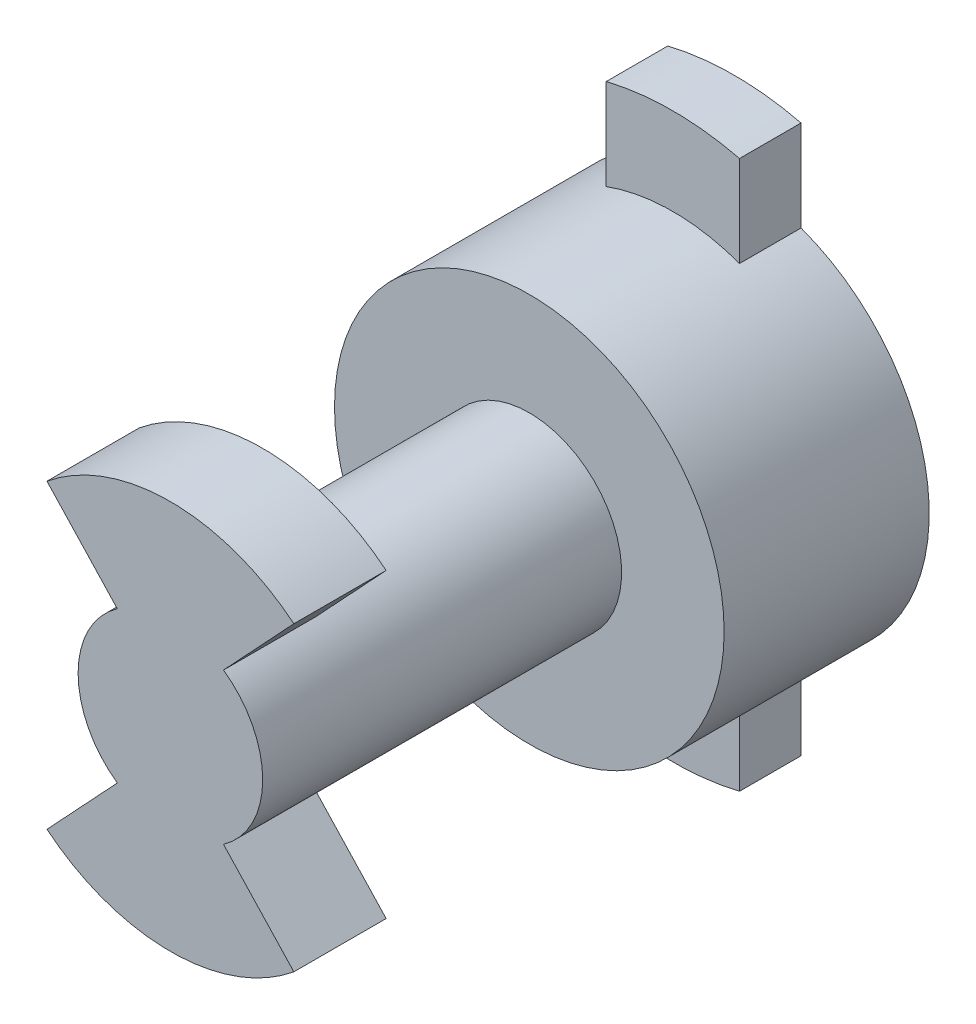
ISO-10303-21;
HEADER;
FILE_DESCRIPTION(('STEP AP214'),'2;1');
FILE_NAME('part.step','',(''),(''),'','','');
FILE_SCHEMA(('AUTOMOTIVE_DESIGN { 1 0 10303 214 1 1 1 1 }'));
ENDSEC;
DATA;
#1=APPLICATION_CONTEXT('core data for automotive mechanical design processes');
#2=APPLICATION_PROTOCOL_DEFINITION('international standard','automotive_design',2000,#1);
#3=PRODUCT_CONTEXT('',#1,'mechanical');
#4=PRODUCT('Part','Part','',(#3));
#5=PRODUCT_RELATED_PRODUCT_CATEGORY('part','',(#4));
#6=PRODUCT_DEFINITION_FORMATION('','',#4);
#7=PRODUCT_DEFINITION_CONTEXT('part definition',#1,'design');
#8=PRODUCT_DEFINITION('design','',#6,#7);
#9=PRODUCT_DEFINITION_SHAPE('','',#8);
#10=(LENGTH_UNIT() NAMED_UNIT(*) SI_UNIT(.MILLI.,.METRE.));
#11=(NAMED_UNIT(*) PLANE_ANGLE_UNIT() SI_UNIT($,.RADIAN.));
#12=(NAMED_UNIT(*) SI_UNIT($,.STERADIAN.) SOLID_ANGLE_UNIT());
#13=UNCERTAINTY_MEASURE_WITH_UNIT(LENGTH_MEASURE(1.E-05),#10,'distance_accuracy_value','');
#14=(GEOMETRIC_REPRESENTATION_CONTEXT(3) GLOBAL_UNCERTAINTY_ASSIGNED_CONTEXT((#13)) GLOBAL_UNIT_ASSIGNED_CONTEXT((#10,
#11,#12)) REPRESENTATION_CONTEXT('',''));
#15=CARTESIAN_POINT('',(0.,0.,0.));
#16=DIRECTION('',(0.,0.,1.));
#17=DIRECTION('',(1.,0.,0.));
#18=AXIS2_PLACEMENT_3D('',#15,#16,#17);
#19=CARTESIAN_POINT('',(0.,0.,-13.));
#20=DIRECTION('',(0.,0.,-1.));
#21=DIRECTION('',(-1.,0.,0.));
#22=AXIS2_PLACEMENT_3D('',#19,#20,#21);
#23=CYLINDRICAL_SURFACE('',#22,9.49890153901533);
#24=DIRECTION('',(0.,0.,-1.));
#25=VECTOR('',#24,1.);
#26=CARTESIAN_POINT('',(3.25,-8.92561653040886,-20.));
#27=LINE('',#26,#25);
#28=CARTESIAN_POINT('',(3.25,-8.92561653040886,-20.));
#29=VERTEX_POINT('',#28);
#30=CARTESIAN_POINT('',(3.25,-8.92561653040886,-23.));
#31=VERTEX_POINT('',#30);
#32=EDGE_CURVE('E185',#29,#31,#27,.T.);
#33=ORIENTED_EDGE('',*,*,#32,.T.);
#34=CARTESIAN_POINT('',(0.,0.,-23.));
#35=DIRECTION('',(0.,0.,-1.));
#36=DIRECTION('',(-1.,0.,0.));
#37=AXIS2_PLACEMENT_3D('',#34,#35,#36);
#38=CIRCLE('',#37,9.49890153901533);
#39=CARTESIAN_POINT('',(3.25,8.92561653040886,-23.));
#40=VERTEX_POINT('',#39);
#41=EDGE_CURVE('E249',#40,#31,#38,.T.);
#42=ORIENTED_EDGE('',*,*,#41,.F.);
#43=DIRECTION('',(0.,0.,-1.));
#44=VECTOR('',#43,1.);
#45=CARTESIAN_POINT('',(3.25,8.92561653040886,-20.));
#46=LINE('',#45,#44);
#47=CARTESIAN_POINT('',(3.25,8.92561653040886,-20.));
#48=VERTEX_POINT('',#47);
#49=EDGE_CURVE('E236',#48,#40,#46,.T.);
#50=ORIENTED_EDGE('',*,*,#49,.F.);
#51=CARTESIAN_POINT('',(0.,0.,-20.));
#52=DIRECTION('',(0.,0.,-1.));
#53=DIRECTION('',(-1.,0.,0.));
#54=AXIS2_PLACEMENT_3D('',#51,#52,#53);
#55=CIRCLE('',#54,9.49890153901533);
#56=CARTESIAN_POINT('',(-3.25,8.92561653040886,-20.));
#57=VERTEX_POINT('',#56);
#58=EDGE_CURVE('E219',#57,#48,#55,.T.);
#59=ORIENTED_EDGE('',*,*,#58,.F.);
#60=DIRECTION('',(0.,0.,-1.));
#61=VECTOR('',#60,1.);
#62=CARTESIAN_POINT('',(-3.25,8.92561653040886,-20.));
#63=LINE('',#62,#61);
#64=CARTESIAN_POINT('',(-3.25,8.92561653040886,-23.));
#65=VERTEX_POINT('',#64);
#66=EDGE_CURVE('E231',#57,#65,#63,.T.);
#67=ORIENTED_EDGE('',*,*,#66,.T.);
#68=CARTESIAN_POINT('',(-3.25,-8.92561653040886,-23.));
#69=VERTEX_POINT('',#68);
#70=EDGE_CURVE('E235',#69,#65,#38,.T.);
#71=ORIENTED_EDGE('',*,*,#70,.F.);
#72=DIRECTION('',(0.,0.,-1.));
#73=VECTOR('',#72,1.);
#74=CARTESIAN_POINT('',(-3.25,-8.92561653040886,-20.));
#75=LINE('',#74,#73);
#76=CARTESIAN_POINT('',(-3.25,-8.92561653040886,-20.));
#77=VERTEX_POINT('',#76);
#78=EDGE_CURVE('E203',#77,#69,#75,.T.);
#79=ORIENTED_EDGE('',*,*,#78,.F.);
#80=CARTESIAN_POINT('',(0.,0.,-20.));
#81=DIRECTION('',(0.,0.,-1.));
#82=DIRECTION('',(-1.,0.,0.));
#83=AXIS2_PLACEMENT_3D('',#80,#81,#82);
#84=CIRCLE('',#83,9.49890153901533);
#85=EDGE_CURVE('E171',#29,#77,#84,.T.);
#86=ORIENTED_EDGE('',*,*,#85,.F.);
#87=EDGE_LOOP('',(#33,#42,#50,#59,#67,#71,#79,#86));
#88=FACE_BOUND('',#87,.T.);
#89=CARTESIAN_POINT('',(0.,0.,-13.));
#90=DIRECTION('',(0.,0.,-1.));
#91=DIRECTION('',(-1.,0.,0.));
#92=AXIS2_PLACEMENT_3D('',#89,#90,#91);
#93=CIRCLE('',#92,9.49890153901533);
#94=CARTESIAN_POINT('',(-9.49890153901533,0.,-13.));
#95=VERTEX_POINT('',#94);
#96=EDGE_CURVE('E244',#95,#95,#93,.T.);
#97=ORIENTED_EDGE('',*,*,#96,.T.);
#98=EDGE_LOOP('',(#97));
#99=FACE_BOUND('',#98,.T.);
#100=ADVANCED_FACE('F45',(#88,#99),#23,.T.);
#101=CARTESIAN_POINT('',(0.,0.,4.5));
#102=DIRECTION('',(0.,0.,-1.));
#103=DIRECTION('',(-1.,0.,0.));
#104=AXIS2_PLACEMENT_3D('',#101,#102,#103);
#105=CYLINDRICAL_SURFACE('',#104,4.5);
#106=DIRECTION('',(0.,0.,-1.));
#107=VECTOR('',#106,1.);
#108=CARTESIAN_POINT('',(2.58977727060091,-3.68008881532483,4.5));
#109=LINE('',#108,#107);
#110=CARTESIAN_POINT('',(2.58977727060091,-3.68008881532483,4.5));
#111=VERTEX_POINT('',#110);
#112=CARTESIAN_POINT('',(2.58977727060091,-3.68008881532483,0.));
#113=VERTEX_POINT('',#112);
#114=EDGE_CURVE('E312',#111,#113,#109,.T.);
#115=ORIENTED_EDGE('',*,*,#114,.T.);
#116=CARTESIAN_POINT('',(0.,0.,0.));
#117=DIRECTION('',(0.,0.,1.));
#118=DIRECTION('',(1.,0.,0.));
#119=AXIS2_PLACEMENT_3D('',#116,#117,#118);
#120=CIRCLE('',#119,4.5);
#121=CARTESIAN_POINT('',(-2.58977727060091,-3.68008881532483,0.));
#122=VERTEX_POINT('',#121);
#123=EDGE_CURVE('E54',#122,#113,#120,.T.);
#124=ORIENTED_EDGE('',*,*,#123,.F.);
#125=DIRECTION('',(0.,0.,-1.));
#126=VECTOR('',#125,1.);
#127=CARTESIAN_POINT('',(-2.58977727060091,-3.68008881532483,4.5));
#128=LINE('',#127,#126);
#129=CARTESIAN_POINT('',(-2.58977727060091,-3.68008881532483,4.5));
#130=VERTEX_POINT('',#129);
#131=EDGE_CURVE('E323',#130,#122,#128,.T.);
#132=ORIENTED_EDGE('',*,*,#131,.F.);
#133=CARTESIAN_POINT('',(0.,0.,4.5));
#134=DIRECTION('',(0.,0.,1.));
#135=DIRECTION('',(1.,0.,0.));
#136=AXIS2_PLACEMENT_3D('',#133,#134,#135);
#137=CIRCLE('',#136,4.5);
#138=CARTESIAN_POINT('',(-2.58977727060091,3.68008881532483,4.5));
#139=VERTEX_POINT('',#138);
#140=EDGE_CURVE('E259',#139,#130,#137,.T.);
#141=ORIENTED_EDGE('',*,*,#140,.F.);
#142=DIRECTION('',(0.,0.,-1.));
#143=VECTOR('',#142,1.);
#144=CARTESIAN_POINT('',(-2.58977727060091,3.68008881532483,4.5));
#145=LINE('',#144,#143);
#146=CARTESIAN_POINT('',(-2.58977727060091,3.68008881532483,0.));
#147=VERTEX_POINT('',#146);
#148=EDGE_CURVE('E326',#139,#147,#145,.T.);
#149=ORIENTED_EDGE('',*,*,#148,.T.);
#150=CARTESIAN_POINT('',(2.58977727060091,3.68008881532483,0.));
#151=VERTEX_POINT('',#150);
#152=EDGE_CURVE('E248',#151,#147,#120,.T.);
#153=ORIENTED_EDGE('',*,*,#152,.F.);
#154=DIRECTION('',(0.,0.,-1.));
#155=VECTOR('',#154,1.);
#156=CARTESIAN_POINT('',(2.58977727060091,3.68008881532483,4.5));
#157=LINE('',#156,#155);
#158=CARTESIAN_POINT('',(2.58977727060091,3.68008881532483,4.5));
#159=VERTEX_POINT('',#158);
#160=EDGE_CURVE('E308',#159,#151,#157,.T.);
#161=ORIENTED_EDGE('',*,*,#160,.F.);
#162=EDGE_CURVE('E264',#111,#159,#137,.T.);
#163=ORIENTED_EDGE('',*,*,#162,.F.);
#164=EDGE_LOOP('',(#115,#124,#132,#141,#149,#153,#161,#163));
#165=FACE_BOUND('',#164,.T.);
#166=CARTESIAN_POINT('',(0.,0.,-13.));
#167=DIRECTION('',(0.,0.,-1.));
#168=DIRECTION('',(-1.,0.,0.));
#169=AXIS2_PLACEMENT_3D('',#166,#167,#168);
#170=CIRCLE('',#169,4.5);
#171=CARTESIAN_POINT('',(-4.5,0.,-13.));
#172=VERTEX_POINT('',#171);
#173=EDGE_CURVE('E11',#172,#172,#170,.T.);
#174=ORIENTED_EDGE('',*,*,#173,.F.);
#175=EDGE_LOOP('',(#174));
#176=FACE_BOUND('',#175,.T.);
#177=ADVANCED_FACE('F340',(#165,#176),#105,.T.);
#178=CARTESIAN_POINT('',(0.,0.,0.));
#179=DIRECTION('',(0.,0.,1.));
#180=DIRECTION('',(1.,0.,0.));
#181=AXIS2_PLACEMENT_3D('',#178,#179,#180);
#182=PLANE('',#181);
#183=DIRECTION('',(-0.682795620095507,-0.730609431350563,0.));
#184=VECTOR('',#183,1.);
#185=CARTESIAN_POINT('',(-0.453440195838728,0.423765375053551,0.));
#186=LINE('',#185,#184);
#187=CARTESIAN_POINT('',(6.01926114637967,7.34972756309267,0.));
#188=VERTEX_POINT('',#187);
#189=EDGE_CURVE('E296',#188,#151,#186,.T.);
#190=ORIENTED_EDGE('',*,*,#189,.T.);
#191=ORIENTED_EDGE('',*,*,#152,.T.);
#192=DIRECTION('',(-0.682795620095507,0.730609431350562,0.));
#193=VECTOR('',#192,1.);
#194=CARTESIAN_POINT('',(0.45344019583873,0.423765375053552,0.));
#195=LINE('',#194,#193);
#196=CARTESIAN_POINT('',(-6.01926114637967,7.34972756309267,0.));
#197=VERTEX_POINT('',#196);
#198=EDGE_CURVE('E254',#147,#197,#195,.T.);
#199=ORIENTED_EDGE('',*,*,#198,.T.);
#200=CARTESIAN_POINT('',(0.,0.,0.));
#201=DIRECTION('',(0.,0.,1.));
#202=DIRECTION('',(1.,0.,0.));
#203=AXIS2_PLACEMENT_3D('',#200,#201,#202);
#204=CIRCLE('',#203,9.5);
#205=EDGE_CURVE('E260',#188,#197,#204,.T.);
#206=ORIENTED_EDGE('',*,*,#205,.F.);
#207=EDGE_LOOP('',(#190,#191,#199,#206));
#208=FACE_BOUND('',#207,.T.);
#209=ADVANCED_FACE('F363',(#208),#182,.F.);
#210=CARTESIAN_POINT('',(0.45344019583873,0.423765375053552,4.5));
#211=DIRECTION('',(-0.730609431350562,-0.682795620095507,0.));
#212=DIRECTION('',(0.682795620095507,-0.730609431350562,0.));
#213=AXIS2_PLACEMENT_3D('',#210,#211,#212);
#214=PLANE('',#213);
#215=ORIENTED_EDGE('',*,*,#198,.F.);
#216=ORIENTED_EDGE('',*,*,#148,.F.);
#217=DIRECTION('',(-0.682795620095507,0.730609431350562,0.));
#218=VECTOR('',#217,1.);
#219=CARTESIAN_POINT('',(0.45344019583873,0.423765375053552,4.5));
#220=LINE('',#219,#218);
#221=CARTESIAN_POINT('',(-6.01926114637967,7.34972756309267,4.5));
#222=VERTEX_POINT('',#221);
#223=EDGE_CURVE('E255',#139,#222,#220,.T.);
#224=ORIENTED_EDGE('',*,*,#223,.T.);
#225=DIRECTION('',(0.,0.,-1.));
#226=VECTOR('',#225,1.);
#227=CARTESIAN_POINT('',(-6.01926114637967,7.34972756309267,4.5));
#228=LINE('',#227,#226);
#229=EDGE_CURVE('E281',#222,#197,#228,.T.);
#230=ORIENTED_EDGE('',*,*,#229,.T.);
#231=EDGE_LOOP('',(#215,#216,#224,#230));
#232=FACE_BOUND('',#231,.T.);
#233=ADVANCED_FACE('F47',(#232),#214,.T.);
#234=CARTESIAN_POINT('',(0.453440195838729,-0.423765375053552,4.5));
#235=DIRECTION('',(0.730609431350562,-0.682795620095507,0.));
#236=DIRECTION('',(0.682795620095507,0.730609431350562,0.));
#237=AXIS2_PLACEMENT_3D('',#234,#235,#236);
#238=PLANE('',#237);
#239=DIRECTION('',(-0.682795620095507,-0.730609431350562,0.));
#240=VECTOR('',#239,1.);
#241=CARTESIAN_POINT('',(0.453440195838729,-0.423765375053552,0.));
#242=LINE('',#241,#240);
#243=CARTESIAN_POINT('',(-6.01926114637967,-7.34972756309267,0.));
#244=VERTEX_POINT('',#243);
#245=EDGE_CURVE('E285',#122,#244,#242,.T.);
#246=ORIENTED_EDGE('',*,*,#245,.T.);
#247=DIRECTION('',(0.,0.,-1.));
#248=VECTOR('',#247,1.);
#249=CARTESIAN_POINT('',(-6.01926114637967,-7.34972756309267,4.5));
#250=LINE('',#249,#248);
#251=CARTESIAN_POINT('',(-6.01926114637967,-7.34972756309267,4.5));
#252=VERTEX_POINT('',#251);
#253=EDGE_CURVE('E319',#252,#244,#250,.T.);
#254=ORIENTED_EDGE('',*,*,#253,.F.);
#255=DIRECTION('',(-0.682795620095507,-0.730609431350562,0.));
#256=VECTOR('',#255,1.);
#257=CARTESIAN_POINT('',(0.453440195838729,-0.423765375053552,4.5));
#258=LINE('',#257,#256);
#259=EDGE_CURVE('E263',#130,#252,#258,.T.);
#260=ORIENTED_EDGE('',*,*,#259,.F.);
#261=ORIENTED_EDGE('',*,*,#131,.T.);
#262=EDGE_LOOP('',(#246,#254,#260,#261));
#263=FACE_BOUND('',#262,.T.);
#264=ADVANCED_FACE('F353',(#263),#238,.F.);
#265=CARTESIAN_POINT('',(0.,0.,4.5));
#266=DIRECTION('',(0.,0.,-1.));
#267=DIRECTION('',(-1.,0.,0.));
#268=AXIS2_PLACEMENT_3D('',#265,#266,#267);
#269=CYLINDRICAL_SURFACE('',#268,9.5);
#270=CARTESIAN_POINT('',(0.,0.,0.));
#271=DIRECTION('',(0.,0.,1.));
#272=DIRECTION('',(1.,0.,0.));
#273=AXIS2_PLACEMENT_3D('',#270,#271,#272);
#274=CIRCLE('',#273,9.5);
#275=CARTESIAN_POINT('',(6.01926114637967,-7.34972756309267,0.));
#276=VERTEX_POINT('',#275);
#277=EDGE_CURVE('E288',#244,#276,#274,.T.);
#278=ORIENTED_EDGE('',*,*,#277,.T.);
#279=DIRECTION('',(0.,0.,-1.));
#280=VECTOR('',#279,1.);
#281=CARTESIAN_POINT('',(6.01926114637967,-7.34972756309267,4.5));
#282=LINE('',#281,#280);
#283=CARTESIAN_POINT('',(6.01926114637967,-7.34972756309267,4.5));
#284=VERTEX_POINT('',#283);
#285=EDGE_CURVE('E316',#284,#276,#282,.T.);
#286=ORIENTED_EDGE('',*,*,#285,.F.);
#287=CARTESIAN_POINT('',(0.,0.,4.5));
#288=DIRECTION('',(0.,0.,1.));
#289=DIRECTION('',(1.,0.,0.));
#290=AXIS2_PLACEMENT_3D('',#287,#288,#289);
#291=CIRCLE('',#290,9.5);
#292=EDGE_CURVE('E267',#252,#284,#291,.T.);
#293=ORIENTED_EDGE('',*,*,#292,.F.);
#294=ORIENTED_EDGE('',*,*,#253,.T.);
#295=EDGE_LOOP('',(#278,#286,#293,#294));
#296=FACE_BOUND('',#295,.T.);
#297=ADVANCED_FACE('F349',(#296),#269,.T.);
#298=CARTESIAN_POINT('',(-0.453440195838729,-0.423765375053552,4.5));
#299=DIRECTION('',(0.730609431350562,0.682795620095507,0.));
#300=DIRECTION('',(-0.682795620095507,0.730609431350563,0.));
#301=AXIS2_PLACEMENT_3D('',#298,#299,#300);
#302=PLANE('',#301);
#303=DIRECTION('',(0.682795620095507,-0.730609431350563,0.));
#304=VECTOR('',#303,1.);
#305=CARTESIAN_POINT('',(-0.453440195838729,-0.423765375053552,0.));
#306=LINE('',#305,#304);
#307=EDGE_CURVE('E292',#113,#276,#306,.T.);
#308=ORIENTED_EDGE('',*,*,#307,.F.);
#309=ORIENTED_EDGE('',*,*,#114,.F.);
#310=DIRECTION('',(0.682795620095507,-0.730609431350563,0.));
#311=VECTOR('',#310,1.);
#312=CARTESIAN_POINT('',(-0.453440195838729,-0.423765375053552,4.5));
#313=LINE('',#312,#311);
#314=EDGE_CURVE('E270',#111,#284,#313,.T.);
#315=ORIENTED_EDGE('',*,*,#314,.T.);
#316=ORIENTED_EDGE('',*,*,#285,.T.);
#317=EDGE_LOOP('',(#308,#309,#315,#316));
#318=FACE_BOUND('',#317,.T.);
#319=ADVANCED_FACE('F345',(#318),#302,.T.);
#320=CARTESIAN_POINT('',(-0.453440195838728,0.423765375053551,4.5));
#321=DIRECTION('',(0.730609431350562,-0.682795620095507,0.));
#322=DIRECTION('',(0.682795620095507,0.730609431350563,0.));
#323=AXIS2_PLACEMENT_3D('',#320,#321,#322);
#324=PLANE('',#323);
#325=ORIENTED_EDGE('',*,*,#189,.F.);
#326=DIRECTION('',(0.,0.,-1.));
#327=VECTOR('',#326,1.);
#328=CARTESIAN_POINT('',(6.01926114637967,7.34972756309267,4.5));
#329=LINE('',#328,#327);
#330=CARTESIAN_POINT('',(6.01926114637967,7.34972756309267,4.5));
#331=VERTEX_POINT('',#330);
#332=EDGE_CURVE('E305',#331,#188,#329,.T.);
#333=ORIENTED_EDGE('',*,*,#332,.F.);
#334=DIRECTION('',(-0.682795620095507,-0.730609431350563,0.));
#335=VECTOR('',#334,1.);
#336=CARTESIAN_POINT('',(-0.453440195838728,0.423765375053551,4.5));
#337=LINE('',#336,#335);
#338=EDGE_CURVE('E274',#331,#159,#337,.T.);
#339=ORIENTED_EDGE('',*,*,#338,.T.);
#340=ORIENTED_EDGE('',*,*,#160,.T.);
#341=EDGE_LOOP('',(#325,#333,#339,#340));
#342=FACE_BOUND('',#341,.T.);
#343=ADVANCED_FACE('F366',(#342),#324,.T.);
#344=CARTESIAN_POINT('',(0.,0.,4.5));
#345=DIRECTION('',(0.,0.,-1.));
#346=DIRECTION('',(-1.,0.,0.));
#347=AXIS2_PLACEMENT_3D('',#344,#345,#346);
#348=CYLINDRICAL_SURFACE('',#347,9.5);
#349=ORIENTED_EDGE('',*,*,#205,.T.);
#350=ORIENTED_EDGE('',*,*,#229,.F.);
#351=CARTESIAN_POINT('',(0.,0.,4.5));
#352=DIRECTION('',(0.,0.,1.));
#353=DIRECTION('',(1.,0.,0.));
#354=AXIS2_PLACEMENT_3D('',#351,#352,#353);
#355=CIRCLE('',#354,9.5);
#356=EDGE_CURVE('E278',#331,#222,#355,.T.);
#357=ORIENTED_EDGE('',*,*,#356,.F.);
#358=ORIENTED_EDGE('',*,*,#332,.T.);
#359=EDGE_LOOP('',(#349,#350,#357,#358));
#360=FACE_BOUND('',#359,.T.);
#361=ADVANCED_FACE('F415',(#360),#348,.T.);
#362=CARTESIAN_POINT('',(0.,0.,4.5));
#363=DIRECTION('',(0.,0.,1.));
#364=DIRECTION('',(1.,0.,0.));
#365=AXIS2_PLACEMENT_3D('',#362,#363,#364);
#366=PLANE('',#365);
#367=ORIENTED_EDGE('',*,*,#223,.F.);
#368=ORIENTED_EDGE('',*,*,#140,.T.);
#369=ORIENTED_EDGE('',*,*,#259,.T.);
#370=ORIENTED_EDGE('',*,*,#292,.T.);
#371=ORIENTED_EDGE('',*,*,#314,.F.);
#372=ORIENTED_EDGE('',*,*,#162,.T.);
#373=ORIENTED_EDGE('',*,*,#338,.F.);
#374=ORIENTED_EDGE('',*,*,#356,.T.);
#375=EDGE_LOOP('',(#367,#368,#369,#370,#371,#372,#373,#374));
#376=FACE_BOUND('',#375,.T.);
#377=ADVANCED_FACE('F356',(#376),#366,.T.);
#378=ORIENTED_EDGE('',*,*,#245,.F.);
#379=ORIENTED_EDGE('',*,*,#123,.T.);
#380=ORIENTED_EDGE('',*,*,#307,.T.);
#381=ORIENTED_EDGE('',*,*,#277,.F.);
#382=EDGE_LOOP('',(#378,#379,#380,#381));
#383=FACE_BOUND('',#382,.T.);
#384=ADVANCED_FACE('F335',(#383),#182,.F.);
#385=CARTESIAN_POINT('',(0.,0.,-13.));
#386=DIRECTION('',(0.,0.,-1.));
#387=DIRECTION('',(-1.,0.,0.));
#388=AXIS2_PLACEMENT_3D('',#385,#386,#387);
#389=PLANE('',#388);
#390=ORIENTED_EDGE('',*,*,#173,.T.);
#391=EDGE_LOOP('',(#390));
#392=FACE_BOUND('',#391,.T.);
#393=ORIENTED_EDGE('',*,*,#96,.F.);
#394=EDGE_LOOP('',(#393));
#395=FACE_BOUND('',#394,.T.);
#396=ADVANCED_FACE('F410',(#392,#395),#389,.F.);
#397=CARTESIAN_POINT('',(0.,0.,-23.));
#398=DIRECTION('',(0.,0.,1.));
#399=DIRECTION('',(1.,0.,0.));
#400=AXIS2_PLACEMENT_3D('',#397,#398,#399);
#401=PLANE('',#400);
#402=ORIENTED_EDGE('',*,*,#41,.T.);
#403=DIRECTION('',(0.,-1.,0.));
#404=VECTOR('',#403,1.);
#405=CARTESIAN_POINT('',(3.25,0.,-23.));
#406=LINE('',#405,#404);
#407=CARTESIAN_POINT('',(3.25,-13.3603892158874,-23.));
#408=VERTEX_POINT('',#407);
#409=EDGE_CURVE('E195',#31,#408,#406,.T.);
#410=ORIENTED_EDGE('',*,*,#409,.T.);
#411=CARTESIAN_POINT('',(0.,0.,-23.));
#412=DIRECTION('',(0.,0.,-1.));
#413=DIRECTION('',(-1.,0.,0.));
#414=AXIS2_PLACEMENT_3D('',#411,#412,#413);
#415=CIRCLE('',#414,13.75);
#416=CARTESIAN_POINT('',(-3.25,-13.3603892158874,-23.));
#417=VERTEX_POINT('',#416);
#418=EDGE_CURVE('E165',#408,#417,#415,.T.);
#419=ORIENTED_EDGE('',*,*,#418,.T.);
#420=DIRECTION('',(0.,-1.,0.));
#421=VECTOR('',#420,1.);
#422=CARTESIAN_POINT('',(-3.25,0.,-23.));
#423=LINE('',#422,#421);
#424=EDGE_CURVE('E61',#69,#417,#423,.T.);
#425=ORIENTED_EDGE('',*,*,#424,.F.);
#426=ORIENTED_EDGE('',*,*,#70,.T.);
#427=DIRECTION('',(0.,-1.,0.));
#428=VECTOR('',#427,1.);
#429=CARTESIAN_POINT('',(-3.25,0.,-23.));
#430=LINE('',#429,#428);
#431=CARTESIAN_POINT('',(-3.25,13.3603892158874,-23.));
#432=VERTEX_POINT('',#431);
#433=EDGE_CURVE('E202',#432,#65,#430,.T.);
#434=ORIENTED_EDGE('',*,*,#433,.F.);
#435=CARTESIAN_POINT('',(0.,0.,-23.));
#436=DIRECTION('',(0.,0.,-1.));
#437=DIRECTION('',(-1.,0.,0.));
#438=AXIS2_PLACEMENT_3D('',#435,#436,#437);
#439=CIRCLE('',#438,13.75);
#440=CARTESIAN_POINT('',(3.25,13.3603892158874,-23.));
#441=VERTEX_POINT('',#440);
#442=EDGE_CURVE('E226',#432,#441,#439,.T.);
#443=ORIENTED_EDGE('',*,*,#442,.T.);
#444=DIRECTION('',(0.,-1.,0.));
#445=VECTOR('',#444,1.);
#446=CARTESIAN_POINT('',(3.25,0.,-23.));
#447=LINE('',#446,#445);
#448=EDGE_CURVE('E68',#441,#40,#447,.T.);
#449=ORIENTED_EDGE('',*,*,#448,.T.);
#450=EDGE_LOOP('',(#402,#410,#419,#425,#426,#434,#443,#449));
#451=FACE_BOUND('',#450,.T.);
#452=ADVANCED_FACE('F371',(#451),#401,.F.);
#453=CARTESIAN_POINT('',(-3.25,0.,-20.));
#454=DIRECTION('',(1.,0.,0.));
#455=DIRECTION('',(0.,0.,-1.));
#456=AXIS2_PLACEMENT_3D('',#453,#454,#455);
#457=PLANE('',#456);
#458=ORIENTED_EDGE('',*,*,#433,.T.);
#459=ORIENTED_EDGE('',*,*,#66,.F.);
#460=DIRECTION('',(0.,-1.,0.));
#461=VECTOR('',#460,1.);
#462=CARTESIAN_POINT('',(-3.25,0.,-20.));
#463=LINE('',#462,#461);
#464=CARTESIAN_POINT('',(-3.25,13.3603892158874,-20.));
#465=VERTEX_POINT('',#464);
#466=EDGE_CURVE('E208',#465,#57,#463,.T.);
#467=ORIENTED_EDGE('',*,*,#466,.F.);
#468=DIRECTION('',(0.,0.,-1.));
#469=VECTOR('',#468,1.);
#470=CARTESIAN_POINT('',(-3.25,13.3603892158874,-20.));
#471=LINE('',#470,#469);
#472=EDGE_CURVE('E222',#465,#432,#471,.T.);
#473=ORIENTED_EDGE('',*,*,#472,.T.);
#474=EDGE_LOOP('',(#458,#459,#467,#473));
#475=FACE_BOUND('',#474,.T.);
#476=ADVANCED_FACE('F377',(#475),#457,.F.);
#477=CARTESIAN_POINT('',(3.25,0.,-20.));
#478=DIRECTION('',(1.,0.,0.));
#479=DIRECTION('',(0.,0.,-1.));
#480=AXIS2_PLACEMENT_3D('',#477,#478,#479);
#481=PLANE('',#480);
#482=ORIENTED_EDGE('',*,*,#448,.F.);
#483=DIRECTION('',(0.,0.,-1.));
#484=VECTOR('',#483,1.);
#485=CARTESIAN_POINT('',(3.25,13.3603892158874,-20.));
#486=LINE('',#485,#484);
#487=CARTESIAN_POINT('',(3.25,13.3603892158874,-20.));
#488=VERTEX_POINT('',#487);
#489=EDGE_CURVE('E239',#488,#441,#486,.T.);
#490=ORIENTED_EDGE('',*,*,#489,.F.);
#491=DIRECTION('',(0.,-1.,0.));
#492=VECTOR('',#491,1.);
#493=CARTESIAN_POINT('',(3.25,0.,-20.));
#494=LINE('',#493,#492);
#495=EDGE_CURVE('E215',#488,#48,#494,.T.);
#496=ORIENTED_EDGE('',*,*,#495,.T.);
#497=ORIENTED_EDGE('',*,*,#49,.T.);
#498=EDGE_LOOP('',(#482,#490,#496,#497));
#499=FACE_BOUND('',#498,.T.);
#500=ADVANCED_FACE('F388',(#499),#481,.T.);
#501=CARTESIAN_POINT('',(0.,0.,-20.));
#502=DIRECTION('',(0.,0.,-1.));
#503=DIRECTION('',(-1.,0.,0.));
#504=AXIS2_PLACEMENT_3D('',#501,#502,#503);
#505=CYLINDRICAL_SURFACE('',#504,13.75);
#506=ORIENTED_EDGE('',*,*,#442,.F.);
#507=ORIENTED_EDGE('',*,*,#472,.F.);
#508=CARTESIAN_POINT('',(0.,0.,-20.));
#509=DIRECTION('',(0.,0.,-1.));
#510=DIRECTION('',(-1.,0.,0.));
#511=AXIS2_PLACEMENT_3D('',#508,#509,#510);
#512=CIRCLE('',#511,13.75);
#513=EDGE_CURVE('E211',#465,#488,#512,.T.);
#514=ORIENTED_EDGE('',*,*,#513,.T.);
#515=ORIENTED_EDGE('',*,*,#489,.T.);
#516=EDGE_LOOP('',(#506,#507,#514,#515));
#517=FACE_BOUND('',#516,.T.);
#518=ADVANCED_FACE('F390',(#517),#505,.T.);
#519=CARTESIAN_POINT('',(0.,0.,-20.));
#520=DIRECTION('',(0.,0.,-1.));
#521=DIRECTION('',(-1.,0.,0.));
#522=AXIS2_PLACEMENT_3D('',#519,#520,#521);
#523=PLANE('',#522);
#524=ORIENTED_EDGE('',*,*,#466,.T.);
#525=ORIENTED_EDGE('',*,*,#58,.T.);
#526=ORIENTED_EDGE('',*,*,#495,.F.);
#527=ORIENTED_EDGE('',*,*,#513,.F.);
#528=EDGE_LOOP('',(#524,#525,#526,#527));
#529=FACE_BOUND('',#528,.T.);
#530=ADVANCED_FACE('F385',(#529),#523,.F.);
#531=CARTESIAN_POINT('',(3.25,0.,-20.));
#532=DIRECTION('',(1.,0.,0.));
#533=DIRECTION('',(0.,0.,-1.));
#534=AXIS2_PLACEMENT_3D('',#531,#532,#533);
#535=PLANE('',#534);
#536=ORIENTED_EDGE('',*,*,#409,.F.);
#537=ORIENTED_EDGE('',*,*,#32,.F.);
#538=DIRECTION('',(0.,-1.,0.));
#539=VECTOR('',#538,1.);
#540=CARTESIAN_POINT('',(3.25,0.,-20.));
#541=LINE('',#540,#539);
#542=CARTESIAN_POINT('',(3.25,-13.3603892158874,-20.));
#543=VERTEX_POINT('',#542);
#544=EDGE_CURVE('E176',#29,#543,#541,.T.);
#545=ORIENTED_EDGE('',*,*,#544,.T.);
#546=DIRECTION('',(0.,0.,-1.));
#547=VECTOR('',#546,1.);
#548=CARTESIAN_POINT('',(3.25,-13.3603892158874,-20.));
#549=LINE('',#548,#547);
#550=EDGE_CURVE('E161',#543,#408,#549,.T.);
#551=ORIENTED_EDGE('',*,*,#550,.T.);
#552=EDGE_LOOP('',(#536,#537,#545,#551));
#553=FACE_BOUND('',#552,.T.);
#554=ADVANCED_FACE('F183',(#553),#535,.T.);
#555=CARTESIAN_POINT('',(-3.25,0.,-20.));
#556=DIRECTION('',(1.,0.,0.));
#557=DIRECTION('',(0.,0.,-1.));
#558=AXIS2_PLACEMENT_3D('',#555,#556,#557);
#559=PLANE('',#558);
#560=ORIENTED_EDGE('',*,*,#424,.T.);
#561=DIRECTION('',(0.,0.,-1.));
#562=VECTOR('',#561,1.);
#563=CARTESIAN_POINT('',(-3.25,-13.3603892158874,-20.));
#564=LINE('',#563,#562);
#565=CARTESIAN_POINT('',(-3.25,-13.3603892158874,-20.));
#566=VERTEX_POINT('',#565);
#567=EDGE_CURVE('E170',#566,#417,#564,.T.);
#568=ORIENTED_EDGE('',*,*,#567,.F.);
#569=DIRECTION('',(0.,-1.,0.));
#570=VECTOR('',#569,1.);
#571=CARTESIAN_POINT('',(-3.25,0.,-20.));
#572=LINE('',#571,#570);
#573=EDGE_CURVE('E179',#77,#566,#572,.T.);
#574=ORIENTED_EDGE('',*,*,#573,.F.);
#575=ORIENTED_EDGE('',*,*,#78,.T.);
#576=EDGE_LOOP('',(#560,#568,#574,#575));
#577=FACE_BOUND('',#576,.T.);
#578=ADVANCED_FACE('F535',(#577),#559,.F.);
#579=CARTESIAN_POINT('',(0.,0.,-20.));
#580=DIRECTION('',(0.,0.,-1.));
#581=DIRECTION('',(-1.,0.,0.));
#582=AXIS2_PLACEMENT_3D('',#579,#580,#581);
#583=CYLINDRICAL_SURFACE('',#582,13.75);
#584=ORIENTED_EDGE('',*,*,#418,.F.);
#585=ORIENTED_EDGE('',*,*,#550,.F.);
#586=CARTESIAN_POINT('',(0.,0.,-20.));
#587=DIRECTION('',(0.,0.,-1.));
#588=DIRECTION('',(-1.,0.,0.));
#589=AXIS2_PLACEMENT_3D('',#586,#587,#588);
#590=CIRCLE('',#589,13.75);
#591=EDGE_CURVE('E164',#543,#566,#590,.T.);
#592=ORIENTED_EDGE('',*,*,#591,.T.);
#593=ORIENTED_EDGE('',*,*,#567,.T.);
#594=EDGE_LOOP('',(#584,#585,#592,#593));
#595=FACE_BOUND('',#594,.T.);
#596=ADVANCED_FACE('F163',(#595),#583,.T.);
#597=CARTESIAN_POINT('',(0.,0.,-20.));
#598=DIRECTION('',(0.,0.,-1.));
#599=DIRECTION('',(-1.,0.,0.));
#600=AXIS2_PLACEMENT_3D('',#597,#598,#599);
#601=PLANE('',#600);
#602=ORIENTED_EDGE('',*,*,#544,.F.);
#603=ORIENTED_EDGE('',*,*,#85,.T.);
#604=ORIENTED_EDGE('',*,*,#573,.T.);
#605=ORIENTED_EDGE('',*,*,#591,.F.);
#606=EDGE_LOOP('',(#602,#603,#604,#605));
#607=FACE_BOUND('',#606,.T.);
#608=ADVANCED_FACE('F175',(#607),#601,.F.);
#609=CLOSED_SHELL('',(#100,#177,#209,#233,#264,#297,#319,#343,#361,#377,#384,#396,#452,#476,
#500,#518,#530,#554,#578,#596,#608));
#610=MANIFOLD_SOLID_BREP('B2',#609);
#611=ADVANCED_BREP_SHAPE_REPRESENTATION('',(#18,#610),#14);
#612=SHAPE_DEFINITION_REPRESENTATION(#9,#611);
ENDSEC;
END-ISO-10303-21;
